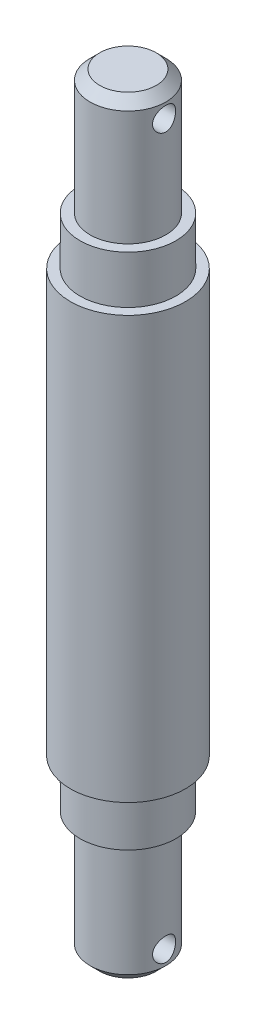
ISO-10303-21;
HEADER;
FILE_DESCRIPTION(('STEP AP214'),'2;1');
FILE_NAME('part.step','',(''),(''),'','','');
FILE_SCHEMA(('AUTOMOTIVE_DESIGN { 1 0 10303 214 1 1 1 1 }'));
ENDSEC;
DATA;
#1=APPLICATION_CONTEXT('core data for automotive mechanical design processes');
#2=APPLICATION_PROTOCOL_DEFINITION('international standard','automotive_design',2000,#1);
#3=PRODUCT_CONTEXT('',#1,'mechanical');
#4=PRODUCT('Part','Part','',(#3));
#5=PRODUCT_RELATED_PRODUCT_CATEGORY('part','',(#4));
#6=PRODUCT_DEFINITION_FORMATION('','',#4);
#7=PRODUCT_DEFINITION_CONTEXT('part definition',#1,'design');
#8=PRODUCT_DEFINITION('design','',#6,#7);
#9=PRODUCT_DEFINITION_SHAPE('','',#8);
#10=(LENGTH_UNIT() NAMED_UNIT(*) SI_UNIT(.MILLI.,.METRE.));
#11=(NAMED_UNIT(*) PLANE_ANGLE_UNIT() SI_UNIT($,.RADIAN.));
#12=(NAMED_UNIT(*) SI_UNIT($,.STERADIAN.) SOLID_ANGLE_UNIT());
#13=UNCERTAINTY_MEASURE_WITH_UNIT(LENGTH_MEASURE(1.E-05),#10,'distance_accuracy_value','');
#14=(GEOMETRIC_REPRESENTATION_CONTEXT(3) GLOBAL_UNCERTAINTY_ASSIGNED_CONTEXT((#13)) GLOBAL_UNIT_ASSIGNED_CONTEXT((#10,
#11,#12)) REPRESENTATION_CONTEXT('',''));
#15=CARTESIAN_POINT('',(0.,0.,0.));
#16=DIRECTION('',(0.,0.,1.));
#17=DIRECTION('',(1.,0.,0.));
#18=AXIS2_PLACEMENT_3D('',#15,#16,#17);
#19=CARTESIAN_POINT('',(0.,44.,0.));
#20=DIRECTION('',(0.,-1.,0.));
#21=DIRECTION('',(0.,0.,-1.));
#22=AXIS2_PLACEMENT_3D('',#19,#20,#21);
#23=CYLINDRICAL_SURFACE('',#22,6.);
#24=CARTESIAN_POINT('',(0.,44.,0.));
#25=DIRECTION('',(0.,1.,0.));
#26=DIRECTION('',(0.,0.,1.));
#27=AXIS2_PLACEMENT_3D('',#24,#25,#26);
#28=CIRCLE('',#27,6.);
#29=CARTESIAN_POINT('',(0.,44.,6.));
#30=VERTEX_POINT('',#29);
#31=EDGE_CURVE('E147',#30,#30,#28,.T.);
#32=ORIENTED_EDGE('',*,*,#31,.F.);
#33=EDGE_LOOP('',(#32));
#34=FACE_BOUND('',#33,.T.);
#35=CARTESIAN_POINT('',(0.,0.,0.));
#36=DIRECTION('',(0.,1.,0.));
#37=DIRECTION('',(0.,0.,1.));
#38=AXIS2_PLACEMENT_3D('',#35,#36,#37);
#39=CIRCLE('',#38,6.);
#40=CARTESIAN_POINT('',(0.,0.,6.));
#41=VERTEX_POINT('',#40);
#42=EDGE_CURVE('E146',#41,#41,#39,.T.);
#43=ORIENTED_EDGE('',*,*,#42,.T.);
#44=EDGE_LOOP('',(#43));
#45=FACE_BOUND('',#44,.T.);
#46=ADVANCED_FACE('F33',(#34,#45),#23,.T.);
#47=CARTESIAN_POINT('',(0.,44.,0.));
#48=DIRECTION('',(0.,1.,0.));
#49=DIRECTION('',(0.,0.,1.));
#50=AXIS2_PLACEMENT_3D('',#47,#48,#49);
#51=PLANE('',#50);
#52=CARTESIAN_POINT('',(0.,44.,0.));
#53=DIRECTION('',(0.,1.,0.));
#54=DIRECTION('',(0.,0.,1.));
#55=AXIS2_PLACEMENT_3D('',#52,#53,#54);
#56=CIRCLE('',#55,5.);
#57=CARTESIAN_POINT('',(0.,44.,5.));
#58=VERTEX_POINT('',#57);
#59=EDGE_CURVE('E138',#58,#58,#56,.F.);
#60=ORIENTED_EDGE('',*,*,#59,.T.);
#61=EDGE_LOOP('',(#60));
#62=FACE_BOUND('',#61,.T.);
#63=ORIENTED_EDGE('',*,*,#31,.T.);
#64=EDGE_LOOP('',(#63));
#65=FACE_BOUND('',#64,.T.);
#66=ADVANCED_FACE('F95',(#62,#65),#51,.T.);
#67=CARTESIAN_POINT('',(0.,0.,0.));
#68=DIRECTION('',(0.,1.,0.));
#69=DIRECTION('',(0.,0.,1.));
#70=AXIS2_PLACEMENT_3D('',#67,#68,#69);
#71=PLANE('',#70);
#72=CARTESIAN_POINT('',(0.,0.,0.));
#73=DIRECTION('',(0.,1.,0.));
#74=DIRECTION('',(0.,0.,1.));
#75=AXIS2_PLACEMENT_3D('',#72,#73,#74);
#76=CIRCLE('',#75,5.);
#77=CARTESIAN_POINT('',(0.,0.,5.));
#78=VERTEX_POINT('',#77);
#79=EDGE_CURVE('E150',#78,#78,#76,.F.);
#80=ORIENTED_EDGE('',*,*,#79,.F.);
#81=EDGE_LOOP('',(#80));
#82=FACE_BOUND('',#81,.T.);
#83=ORIENTED_EDGE('',*,*,#42,.F.);
#84=EDGE_LOOP('',(#83));
#85=FACE_BOUND('',#84,.T.);
#86=ADVANCED_FACE('F101',(#82,#85),#71,.F.);
#87=CARTESIAN_POINT('',(0.,-5.,0.));
#88=DIRECTION('',(0.,-1.,0.));
#89=DIRECTION('',(0.,0.,-1.));
#90=AXIS2_PLACEMENT_3D('',#87,#88,#89);
#91=PLANE('',#90);
#92=CARTESIAN_POINT('',(0.,-5.,0.));
#93=DIRECTION('',(0.,-1.,0.));
#94=DIRECTION('',(0.,0.,-1.));
#95=AXIS2_PLACEMENT_3D('',#92,#93,#94);
#96=CIRCLE('',#95,3.95);
#97=CARTESIAN_POINT('',(0.,-5.,-3.95));
#98=VERTEX_POINT('',#97);
#99=EDGE_CURVE('E142',#98,#98,#96,.T.);
#100=ORIENTED_EDGE('',*,*,#99,.F.);
#101=EDGE_LOOP('',(#100));
#102=FACE_BOUND('',#101,.T.);
#103=CARTESIAN_POINT('',(0.,-5.,0.));
#104=DIRECTION('',(0.,-1.,0.));
#105=DIRECTION('',(0.,0.,-1.));
#106=AXIS2_PLACEMENT_3D('',#103,#104,#105);
#107=CIRCLE('',#106,5.);
#108=CARTESIAN_POINT('',(0.,-5.,-5.));
#109=VERTEX_POINT('',#108);
#110=EDGE_CURVE('E135',#109,#109,#107,.T.);
#111=ORIENTED_EDGE('',*,*,#110,.T.);
#112=EDGE_LOOP('',(#111));
#113=FACE_BOUND('',#112,.T.);
#114=ADVANCED_FACE('F113',(#102,#113),#91,.T.);
#115=CARTESIAN_POINT('',(0.,-5.,0.));
#116=DIRECTION('',(0.,1.,0.));
#117=DIRECTION('',(0.,0.,1.));
#118=AXIS2_PLACEMENT_3D('',#115,#116,#117);
#119=CYLINDRICAL_SURFACE('',#118,5.);
#120=ORIENTED_EDGE('',*,*,#110,.F.);
#121=EDGE_LOOP('',(#120));
#122=FACE_BOUND('',#121,.T.);
#123=ORIENTED_EDGE('',*,*,#79,.T.);
#124=EDGE_LOOP('',(#123));
#125=FACE_BOUND('',#124,.T.);
#126=ADVANCED_FACE('F119',(#122,#125),#119,.T.);
#127=ORIENTED_EDGE('',*,*,#59,.F.);
#128=EDGE_LOOP('',(#127));
#129=FACE_BOUND('',#128,.T.);
#130=CARTESIAN_POINT('',(0.,49.,0.));
#131=DIRECTION('',(0.,-1.,0.));
#132=DIRECTION('',(0.,0.,-1.));
#133=AXIS2_PLACEMENT_3D('',#130,#131,#132);
#134=CIRCLE('',#133,5.);
#135=CARTESIAN_POINT('',(0.,49.,-5.));
#136=VERTEX_POINT('',#135);
#137=EDGE_CURVE('E133',#136,#136,#134,.T.);
#138=ORIENTED_EDGE('',*,*,#137,.T.);
#139=EDGE_LOOP('',(#138));
#140=FACE_BOUND('',#139,.T.);
#141=ADVANCED_FACE('F116',(#129,#140),#119,.T.);
#142=CARTESIAN_POINT('',(0.,49.,0.));
#143=DIRECTION('',(0.,-1.,0.));
#144=DIRECTION('',(0.,0.,-1.));
#145=AXIS2_PLACEMENT_3D('',#142,#143,#144);
#146=PLANE('',#145);
#147=CARTESIAN_POINT('',(0.,49.,0.));
#148=DIRECTION('',(0.,-1.,0.));
#149=DIRECTION('',(0.,0.,-1.));
#150=AXIS2_PLACEMENT_3D('',#147,#148,#149);
#151=CIRCLE('',#150,3.95);
#152=CARTESIAN_POINT('',(0.,49.,-3.95));
#153=VERTEX_POINT('',#152);
#154=EDGE_CURVE('E130',#153,#153,#151,.T.);
#155=ORIENTED_EDGE('',*,*,#154,.T.);
#156=EDGE_LOOP('',(#155));
#157=FACE_BOUND('',#156,.T.);
#158=ORIENTED_EDGE('',*,*,#137,.F.);
#159=EDGE_LOOP('',(#158));
#160=FACE_BOUND('',#159,.T.);
#161=ADVANCED_FACE('F82',(#157,#160),#146,.F.);
#162=CARTESIAN_POINT('',(0.,62.,0.));
#163=DIRECTION('',(0.,1.,0.));
#164=DIRECTION('',(0.,0.,1.));
#165=AXIS2_PLACEMENT_3D('',#162,#163,#164);
#166=PLANE('',#165);
#167=CARTESIAN_POINT('',(0.,62.,0.));
#168=DIRECTION('',(0.,1.,0.));
#169=DIRECTION('',(0.,0.,1.));
#170=AXIS2_PLACEMENT_3D('',#167,#168,#169);
#171=CIRCLE('',#170,2.95);
#172=CARTESIAN_POINT('',(0.,62.,2.95));
#173=VERTEX_POINT('',#172);
#174=EDGE_CURVE('E155',#173,#173,#171,.T.);
#175=ORIENTED_EDGE('',*,*,#174,.T.);
#176=EDGE_LOOP('',(#175));
#177=FACE_BOUND('',#176,.T.);
#178=ADVANCED_FACE('F78',(#177),#166,.T.);
#179=CARTESIAN_POINT('',(0.,-18.,0.));
#180=DIRECTION('',(0.,1.,0.));
#181=DIRECTION('',(0.,0.,1.));
#182=AXIS2_PLACEMENT_3D('',#179,#180,#181);
#183=CYLINDRICAL_SURFACE('',#182,3.95);
#184=CARTESIAN_POINT('',(-3.76330971353674,59.5,-1.2));
#185=CARTESIAN_POINT('',(-3.76331031666007,59.4342869926232,-1.19999928955701));
#186=CARTESIAN_POINT('',(-3.7650497181487,59.3685669566552,-1.19458390291693));
#187=CARTESIAN_POINT('',(-3.77179070728179,59.2390510835481,-1.17312308894901));
#188=CARTESIAN_POINT('',(-3.7767933216099,59.1752558586113,-1.1570743160823));
#189=CARTESIAN_POINT('',(-3.78944298426706,59.0514836230849,-1.11494420920335));
#190=CARTESIAN_POINT('',(-3.79708554829954,58.9915003406798,-1.08887987952481));
#191=CARTESIAN_POINT('',(-3.81414786762899,58.876742568391,-1.02751466965857));
#192=CARTESIAN_POINT('',(-3.82356790350834,58.821968902926,-0.992212330866388));
#193=CARTESIAN_POINT('',(-3.8434666706029,58.7174073950043,-0.912146360257625));
#194=CARTESIAN_POINT('',(-3.85396839206988,58.667813592303,-0.867134979222192));
#195=CARTESIAN_POINT('',(-3.8746510891713,58.5767494003631,-0.769459324041255));
#196=CARTESIAN_POINT('',(-3.88483202238293,58.5352800817988,-0.716794042827508));
#197=CARTESIAN_POINT('',(-3.9039877228981,58.4607953324269,-0.603920990967675));
#198=CARTESIAN_POINT('',(-3.91293225070488,58.4279783421893,-0.543576688024615));
#199=CARTESIAN_POINT('',(-3.92833981706148,58.3730337911179,-0.417907770183142));
#200=CARTESIAN_POINT('',(-3.93480340508098,58.3509038630712,-0.352584261907155));
#201=CARTESIAN_POINT('',(-3.94435813159895,58.3186054863261,-0.220841752036007));
#202=CARTESIAN_POINT('',(-3.94754249662551,58.3081056975429,-0.154510866613134));
#203=CARTESIAN_POINT('',(-3.95050858034244,58.2983173110792,-0.0209576127496339));
#204=CARTESIAN_POINT('',(-3.95029103132449,58.2990263006117,0.046264560720695));
#205=CARTESIAN_POINT('',(-3.94654340150569,58.3114142701222,0.177365433869229));
#206=CARTESIAN_POINT('',(-3.94312170657743,58.3227343247832,0.241281637680937));
#207=CARTESIAN_POINT('',(-3.93348245124689,58.3554359961875,0.366260082461795));
#208=CARTESIAN_POINT('',(-3.92726471210495,58.3768182561704,0.427322140701579));
#209=CARTESIAN_POINT('',(-3.91258346672345,58.4292766646195,0.545704635093445));
#210=CARTESIAN_POINT('',(-3.9040942622956,58.460464503431,0.602972259991862));
#211=CARTESIAN_POINT('',(-3.88576872978898,58.5315600400784,0.711575026037658));
#212=CARTESIAN_POINT('',(-3.87593207589258,58.5714698483086,0.762908726790566));
#213=CARTESIAN_POINT('',(-3.85550417866218,58.6607323384855,0.860327970576577));
#214=CARTESIAN_POINT('',(-3.84489847642231,58.7103956709708,0.906126226960098));
#215=CARTESIAN_POINT('',(-3.82446610848926,58.8167998155064,0.988826771142143));
#216=CARTESIAN_POINT('',(-3.81463952444775,58.8735413677555,1.02572812736943));
#217=CARTESIAN_POINT('',(-3.79680773590534,58.9932642043689,1.08989726798296));
#218=CARTESIAN_POINT('',(-3.78882183614087,59.0563024855972,1.11706447000663));
#219=CARTESIAN_POINT('',(-3.7758038479093,59.1863589312343,1.16031083347001));
#220=CARTESIAN_POINT('',(-3.77077076689899,59.2533757499704,1.17639372104432));
#221=CARTESIAN_POINT('',(-3.76444686513548,59.3867472124612,1.19647276195846));
#222=CARTESIAN_POINT('',(-3.76302061118328,59.45302959203,1.20090658845166));
#223=CARTESIAN_POINT('',(-3.763696891743,59.585393960393,1.19878581496245));
#224=CARTESIAN_POINT('',(-3.76579891714781,59.6514759767199,1.1922328003079));
#225=CARTESIAN_POINT('',(-3.77316174966259,59.7797207289767,1.16871455631674));
#226=CARTESIAN_POINT('',(-3.77833623913779,59.8419410563201,1.15203358279966));
#227=CARTESIAN_POINT('',(-3.79117092753935,59.9626947263443,1.10906377418996));
#228=CARTESIAN_POINT('',(-3.79883151684524,60.0212274882608,1.08277343010514));
#229=CARTESIAN_POINT('',(-3.81603606009353,60.1347183378462,1.02050789468549));
#230=CARTESIAN_POINT('',(-3.82562586475256,60.1895345456271,0.984287088725512));
#231=CARTESIAN_POINT('',(-3.84551089618456,60.2924705849936,0.903478996830666));
#232=CARTESIAN_POINT('',(-3.85580629574318,60.3405887675637,0.85888965693332));
#233=CARTESIAN_POINT('',(-3.87642643567929,60.4306893207721,0.760548602057037));
#234=CARTESIAN_POINT('',(-3.88673678265196,60.4723607633638,0.706508271262426));
#235=CARTESIAN_POINT('',(-3.90582333686135,60.5460527758563,0.591954968425848));
#236=CARTESIAN_POINT('',(-3.91459961873456,60.5780738153305,0.531442311511362));
#237=CARTESIAN_POINT('',(-3.92957652619322,60.6312472089805,0.406054835594853));
#238=CARTESIAN_POINT('',(-3.93579618062284,60.6524801488839,0.341216579421755));
#239=CARTESIAN_POINT('',(-3.94504299892431,60.6836761325366,0.208668709180416));
#240=CARTESIAN_POINT('',(-3.94807110170266,60.6936424908076,0.140959945673024));
#241=CARTESIAN_POINT('',(-3.95053495256332,60.7017651434184,0.00746305887763391));
#242=CARTESIAN_POINT('',(-3.95010769540593,60.7003717979896,-0.0582954695601481));
#243=CARTESIAN_POINT('',(-3.94603329453889,60.686894951455,-0.188600190708616));
#244=CARTESIAN_POINT('',(-3.94238634145233,60.6748120832256,-0.25314645496073));
#245=CARTESIAN_POINT('',(-3.93232268099035,60.6405803852541,-0.378484939604573));
#246=CARTESIAN_POINT('',(-3.92593761167292,60.6185463875531,-0.439311237373909));
#247=CARTESIAN_POINT('',(-3.9110573534815,60.5651408800018,-0.556434673058298));
#248=CARTESIAN_POINT('',(-3.90256181302903,60.5337678142052,-0.612731054274324));
#249=CARTESIAN_POINT('',(-3.88400704310811,60.4613902354797,-0.721191257214665));
#250=CARTESIAN_POINT('',(-3.87390587878802,60.4201051747395,-0.773160625998069));
#251=CARTESIAN_POINT('',(-3.85340865354173,60.3295776192704,-0.869584065464126));
#252=CARTESIAN_POINT('',(-3.84301250743062,60.2803328062374,-0.914035938909721));
#253=CARTESIAN_POINT('',(-3.82272452906287,60.1734644821111,-0.995539285224903));
#254=CARTESIAN_POINT('',(-3.81285808302304,60.1156296640474,-1.03232073531764));
#255=CARTESIAN_POINT('',(-3.79516160158072,59.9943088567936,-1.09559760989955));
#256=CARTESIAN_POINT('',(-3.78733063382032,59.9308254728994,-1.1220977465301));
#257=CARTESIAN_POINT('',(-3.77532652218149,59.806620359224,-1.1618071335272));
#258=CARTESIAN_POINT('',(-3.7708636153341,59.7462682980644,-1.17608922498181));
#259=CARTESIAN_POINT('',(-3.7648552380294,59.6239460096901,-1.19518498249927));
#260=CARTESIAN_POINT('',(-3.763309144711,59.561976130813,-1.2000006700425));
#261=CARTESIAN_POINT('',(-3.76330971353674,59.5,-1.2));
#262=B_SPLINE_CURVE_WITH_KNOTS('',3,(#184,#185,#186,#187,#188,#189,#190,#191,#192,#193,#194,
#195,#196,#197,#198,#199,#200,#201,#202,#203,#204,#205,#206,#207,#208,#209,#210,#211,#212,#213,
#214,#215,#216,#217,#218,#219,#220,#221,#222,#223,#224,#225,#226,#227,#228,#229,#230,#231,#232,
#233,#234,#235,#236,#237,#238,#239,#240,#241,#242,#243,#244,#245,#246,#247,#248,#249,#250,#251,
#252,#253,#254,#255,#256,#257,#258,#259,#260,#261),.UNSPECIFIED.,.T.,.F.,(4,2,2,2,2,2,2,2,2,2,2,
2,2,2,2,2,2,2,2,2,2,2,2,2,2,2,2,2,2,2,2,2,2,2,2,2,2,2,4),(0.,0.196910306936295,
0.393882596395955,0.590521934955348,0.787192339976843,0.989647548186722,1.19212941876558,
1.39891540583195,1.6056555682152,1.80634082085335,2.00698287483511,2.20107397795393,
2.39517749028621,2.59157733311675,2.78802475016897,2.9922295387445,3.19645569979462,
3.40273507852054,3.60894507991807,3.80728870830381,4.00560371949066,4.19859464252232,
4.39161588460553,4.5899256172109,4.78828408651159,4.99434729373731,5.20040047262948,
5.40489095663165,5.60932126580221,5.80568746914948,6.00204204735454,6.19618648295658,
6.39036328234151,6.59086780546126,6.79143083176249,6.99816964858289,7.20481360042108,
7.39056595427499,7.57627863777966),.UNSPECIFIED.);
#263=CARTESIAN_POINT('',(-3.76330971353674,59.5,-1.2));
#264=VERTEX_POINT('',#263);
#265=EDGE_CURVE('E63',#264,#264,#262,.T.);
#266=ORIENTED_EDGE('',*,*,#265,.F.);
#267=EDGE_LOOP('',(#266));
#268=FACE_BOUND('',#267,.T.);
#269=CARTESIAN_POINT('',(3.76330971353674,59.5,-1.2));
#270=CARTESIAN_POINT('',(3.76331031666007,59.5657130073768,-1.19999928955701));
#271=CARTESIAN_POINT('',(3.7650497181487,59.6314330433448,-1.19458390291693));
#272=CARTESIAN_POINT('',(3.77179070728179,59.7609489164519,-1.17312308894901));
#273=CARTESIAN_POINT('',(3.7767933216099,59.8247441413887,-1.1570743160823));
#274=CARTESIAN_POINT('',(3.78944298426706,59.9485163769151,-1.11494420920335));
#275=CARTESIAN_POINT('',(3.79708554829954,60.0084996593202,-1.08887987952481));
#276=CARTESIAN_POINT('',(3.81414786762899,60.123257431609,-1.02751466965857));
#277=CARTESIAN_POINT('',(3.82356790350834,60.178031097074,-0.992212330866387));
#278=CARTESIAN_POINT('',(3.8434666706029,60.2825926049957,-0.912146360257626));
#279=CARTESIAN_POINT('',(3.85396839206988,60.332186407697,-0.867134979222194));
#280=CARTESIAN_POINT('',(3.8746510891713,60.4232505996369,-0.769459324041258));
#281=CARTESIAN_POINT('',(3.88483202238293,60.4647199182011,-0.716794042827509));
#282=CARTESIAN_POINT('',(3.9039877228981,60.539204667573,-0.603920990967674));
#283=CARTESIAN_POINT('',(3.91293225070488,60.5720216578107,-0.543576688024615));
#284=CARTESIAN_POINT('',(3.92833981706148,60.6269662088821,-0.417907770183142));
#285=CARTESIAN_POINT('',(3.93480340508098,60.6490961369288,-0.352584261907156));
#286=CARTESIAN_POINT('',(3.94435813159895,60.6813945136739,-0.220841752036008));
#287=CARTESIAN_POINT('',(3.94754249662551,60.6918943024571,-0.154510866613135));
#288=CARTESIAN_POINT('',(3.95050858034244,60.7016826889208,-0.0209576127496344));
#289=CARTESIAN_POINT('',(3.95029103132449,60.7009736993883,0.0462645607206945));
#290=CARTESIAN_POINT('',(3.94654340150569,60.6885857298778,0.177365433869229));
#291=CARTESIAN_POINT('',(3.94312170657743,60.6772656752168,0.241281637680936));
#292=CARTESIAN_POINT('',(3.93348245124689,60.6445640038125,0.366260082461794));
#293=CARTESIAN_POINT('',(3.92726471210495,60.6231817438296,0.427322140701579));
#294=CARTESIAN_POINT('',(3.91258346672345,60.5707233353805,0.545704635093445));
#295=CARTESIAN_POINT('',(3.9040942622956,60.539535496569,0.602972259991862));
#296=CARTESIAN_POINT('',(3.88576872978898,60.4684399599216,0.711575026037658));
#297=CARTESIAN_POINT('',(3.87593207589258,60.4285301516914,0.762908726790565));
#298=CARTESIAN_POINT('',(3.85550417866218,60.3392676615145,0.86032797057658));
#299=CARTESIAN_POINT('',(3.84489847642231,60.2896043290292,0.906126226960104));
#300=CARTESIAN_POINT('',(3.82446610848926,60.1832001844936,0.988826771142149));
#301=CARTESIAN_POINT('',(3.81463952444775,60.1264586322445,1.02572812736943));
#302=CARTESIAN_POINT('',(3.79680773590534,60.006735795631,1.08989726798296));
#303=CARTESIAN_POINT('',(3.78882183614086,59.9436975144028,1.11706447000663));
#304=CARTESIAN_POINT('',(3.77580384790929,59.8136410687657,1.16031083347002));
#305=CARTESIAN_POINT('',(3.77077076689899,59.7466242500296,1.17639372104432));
#306=CARTESIAN_POINT('',(3.76444686513548,59.6132527875388,1.19647276195846));
#307=CARTESIAN_POINT('',(3.76302061118328,59.54697040797,1.20090658845166));
#308=CARTESIAN_POINT('',(3.763696891743,59.414606039607,1.19878581496245));
#309=CARTESIAN_POINT('',(3.76579891714781,59.3485240232801,1.1922328003079));
#310=CARTESIAN_POINT('',(3.77316174966259,59.2202792710233,1.16871455631674));
#311=CARTESIAN_POINT('',(3.77833623913779,59.1580589436799,1.15203358279966));
#312=CARTESIAN_POINT('',(3.79117092753935,59.0373052736557,1.10906377418996));
#313=CARTESIAN_POINT('',(3.79883151684524,58.9787725117392,1.08277343010514));
#314=CARTESIAN_POINT('',(3.81603606009353,58.8652816621538,1.02050789468549));
#315=CARTESIAN_POINT('',(3.82562586475256,58.8104654543729,0.984287088725513));
#316=CARTESIAN_POINT('',(3.84551089618456,58.7075294150064,0.90347899683067));
#317=CARTESIAN_POINT('',(3.85580629574318,58.6594112324363,0.858889656933325));
#318=CARTESIAN_POINT('',(3.87642643567929,58.5693106792279,0.760548602057044));
#319=CARTESIAN_POINT('',(3.88673678265196,58.5276392366362,0.706508271262434));
#320=CARTESIAN_POINT('',(3.90582333686135,58.4539472241437,0.591954968425855));
#321=CARTESIAN_POINT('',(3.91459961873456,58.4219261846695,0.531442311511367));
#322=CARTESIAN_POINT('',(3.92957652619322,58.3687527910195,0.406054835594857));
#323=CARTESIAN_POINT('',(3.93579618062284,58.3475198511161,0.341216579421759));
#324=CARTESIAN_POINT('',(3.94504299892431,58.3163238674633,0.208668709180418));
#325=CARTESIAN_POINT('',(3.94807110170266,58.3063575091924,0.140959945673025));
#326=CARTESIAN_POINT('',(3.95053495256332,58.2982348565816,0.00746305887763399));
#327=CARTESIAN_POINT('',(3.95010769540593,58.2996282020104,-0.0582954695601479));
#328=CARTESIAN_POINT('',(3.94603329453889,58.313105048545,-0.188600190708616));
#329=CARTESIAN_POINT('',(3.94238634145233,58.3251879167744,-0.25314645496073));
#330=CARTESIAN_POINT('',(3.93232268099035,58.3594196147459,-0.378484939604574));
#331=CARTESIAN_POINT('',(3.92593761167292,58.3814536124469,-0.439311237373911));
#332=CARTESIAN_POINT('',(3.9110573534815,58.4348591199982,-0.5564346730583));
#333=CARTESIAN_POINT('',(3.90256181302903,58.4662321857948,-0.612731054274325));
#334=CARTESIAN_POINT('',(3.88400704310811,58.5386097645203,-0.721191257214665));
#335=CARTESIAN_POINT('',(3.87390587878802,58.5798948252605,-0.773160625998069));
#336=CARTESIAN_POINT('',(3.85340865354173,58.6704223807296,-0.869584065464125));
#337=CARTESIAN_POINT('',(3.84301250743062,58.7196671937626,-0.914035938909721));
#338=CARTESIAN_POINT('',(3.82272452906287,58.8265355178889,-0.995539285224905));
#339=CARTESIAN_POINT('',(3.81285808302304,58.8843703359526,-1.03232073531765));
#340=CARTESIAN_POINT('',(3.79516160158072,59.0056911432064,-1.09559760989955));
#341=CARTESIAN_POINT('',(3.78733063382032,59.0691745271006,-1.12209774653011));
#342=CARTESIAN_POINT('',(3.77532652218149,59.193379640776,-1.1618071335272));
#343=CARTESIAN_POINT('',(3.7708636153341,59.2537317019356,-1.17608922498181));
#344=CARTESIAN_POINT('',(3.7648552380294,59.3760539903099,-1.19518498249927));
#345=CARTESIAN_POINT('',(3.763309144711,59.438023869187,-1.2000006700425));
#346=CARTESIAN_POINT('',(3.76330971353674,59.5,-1.2));
#347=B_SPLINE_CURVE_WITH_KNOTS('',3,(#269,#270,#271,#272,#273,#274,#275,#276,#277,#278,#279,
#280,#281,#282,#283,#284,#285,#286,#287,#288,#289,#290,#291,#292,#293,#294,#295,#296,#297,#298,
#299,#300,#301,#302,#303,#304,#305,#306,#307,#308,#309,#310,#311,#312,#313,#314,#315,#316,#317,
#318,#319,#320,#321,#322,#323,#324,#325,#326,#327,#328,#329,#330,#331,#332,#333,#334,#335,#336,
#337,#338,#339,#340,#341,#342,#343,#344,#345,#346),.UNSPECIFIED.,.T.,.F.,(4,2,2,2,2,2,2,2,2,2,2,
2,2,2,2,2,2,2,2,2,2,2,2,2,2,2,2,2,2,2,2,2,2,2,2,2,2,2,4),(0.,0.196910306936295,
0.393882596395955,0.590521934955348,0.787192339976843,0.98964754818672,1.19212941876558,
1.39891540583195,1.6056555682152,1.80634082085335,2.0069828748351,2.20107397795393,
2.39517749028621,2.59157733311675,2.78802475016897,2.99222953874451,3.19645569979463,
3.40273507852054,3.60894507991808,3.80728870830381,4.00560371949065,4.19859464252231,
4.39161588460553,4.5899256172109,4.78828408651158,4.9943472937373,5.20040047262947,
5.40489095663165,5.60932126580221,5.80568746914948,6.00204204735454,6.19618648295658,
6.39036328234151,6.59086780546126,6.79143083176249,6.9981696485829,7.20481360042108,
7.390565954275,7.57627863777966),.UNSPECIFIED.);
#348=CARTESIAN_POINT('',(3.76330971353674,59.5,-1.2));
#349=VERTEX_POINT('',#348);
#350=EDGE_CURVE('E56',#349,#349,#347,.T.);
#351=ORIENTED_EDGE('',*,*,#350,.F.);
#352=EDGE_LOOP('',(#351));
#353=FACE_BOUND('',#352,.T.);
#354=CARTESIAN_POINT('',(0.,61.,0.));
#355=DIRECTION('',(0.,1.,0.));
#356=DIRECTION('',(0.,0.,1.));
#357=AXIS2_PLACEMENT_3D('',#354,#355,#356);
#358=CIRCLE('',#357,3.95);
#359=CARTESIAN_POINT('',(0.,61.,3.95));
#360=VERTEX_POINT('',#359);
#361=EDGE_CURVE('E52',#360,#360,#358,.F.);
#362=ORIENTED_EDGE('',*,*,#361,.T.);
#363=EDGE_LOOP('',(#362));
#364=FACE_BOUND('',#363,.T.);
#365=ORIENTED_EDGE('',*,*,#154,.F.);
#366=EDGE_LOOP('',(#365));
#367=FACE_BOUND('',#366,.T.);
#368=ADVANCED_FACE('F81',(#268,#353,#364,#367),#183,.T.);
#369=CARTESIAN_POINT('',(-3.76330971353674,-15.5,-1.2));
#370=CARTESIAN_POINT('',(-3.76331031666007,-15.5657130073768,-1.19999928955701));
#371=CARTESIAN_POINT('',(-3.7650497181487,-15.6314330433448,-1.19458390291693));
#372=CARTESIAN_POINT('',(-3.77179070728179,-15.7609489164519,-1.17312308894901));
#373=CARTESIAN_POINT('',(-3.7767933216099,-15.8247441413887,-1.1570743160823));
#374=CARTESIAN_POINT('',(-3.78944298426706,-15.9485163769151,-1.11494420920335));
#375=CARTESIAN_POINT('',(-3.79708554829954,-16.0084996593202,-1.08887987952481));
#376=CARTESIAN_POINT('',(-3.81414786762899,-16.123257431609,-1.02751466965857));
#377=CARTESIAN_POINT('',(-3.82356790350834,-16.178031097074,-0.992212330866386));
#378=CARTESIAN_POINT('',(-3.8434666706029,-16.2825926049957,-0.912146360257624));
#379=CARTESIAN_POINT('',(-3.85396839206988,-16.332186407697,-0.867134979222192));
#380=CARTESIAN_POINT('',(-3.8746510891713,-16.4232505996369,-0.769459324041256));
#381=CARTESIAN_POINT('',(-3.88483202238293,-16.4647199182012,-0.716794042827507));
#382=CARTESIAN_POINT('',(-3.9039877228981,-16.5392046675731,-0.603920990967672));
#383=CARTESIAN_POINT('',(-3.91293225070488,-16.5720216578107,-0.543576688024611));
#384=CARTESIAN_POINT('',(-3.92833981706148,-16.6269662088821,-0.417907770183138));
#385=CARTESIAN_POINT('',(-3.93480340508098,-16.6490961369288,-0.352584261907152));
#386=CARTESIAN_POINT('',(-3.94435813159895,-16.6813945136739,-0.220841752036005));
#387=CARTESIAN_POINT('',(-3.94754249662551,-16.6918943024571,-0.154510866613131));
#388=CARTESIAN_POINT('',(-3.95050858034244,-16.7016826889208,-0.0209576127496303));
#389=CARTESIAN_POINT('',(-3.95029103132449,-16.7009736993883,0.0462645607206986));
#390=CARTESIAN_POINT('',(-3.94654340150569,-16.6885857298778,0.177365433869233));
#391=CARTESIAN_POINT('',(-3.94312170657743,-16.6772656752168,0.24128163768094));
#392=CARTESIAN_POINT('',(-3.93348245124689,-16.6445640038125,0.366260082461798));
#393=CARTESIAN_POINT('',(-3.92726471210495,-16.6231817438296,0.427322140701583));
#394=CARTESIAN_POINT('',(-3.91258346672345,-16.5707233353805,0.545704635093448));
#395=CARTESIAN_POINT('',(-3.9040942622956,-16.5395354965689,0.602972259991865));
#396=CARTESIAN_POINT('',(-3.88576872978898,-16.4684399599216,0.711575026037661));
#397=CARTESIAN_POINT('',(-3.87593207589258,-16.4285301516914,0.762908726790569));
#398=CARTESIAN_POINT('',(-3.85550417866218,-16.3392676615145,0.860327970576583));
#399=CARTESIAN_POINT('',(-3.84489847642231,-16.2896043290292,0.906126226960104));
#400=CARTESIAN_POINT('',(-3.82446610848926,-16.1832001844936,0.988826771142147));
#401=CARTESIAN_POINT('',(-3.81463952444775,-16.1264586322445,1.02572812736943));
#402=CARTESIAN_POINT('',(-3.79680773590534,-16.006735795631,1.08989726798296));
#403=CARTESIAN_POINT('',(-3.78882183614087,-15.9436975144028,1.11706447000663));
#404=CARTESIAN_POINT('',(-3.7758038479093,-15.8136410687657,1.16031083347002));
#405=CARTESIAN_POINT('',(-3.77077076689899,-15.7466242500296,1.17639372104432));
#406=CARTESIAN_POINT('',(-3.76444686513548,-15.6132527875388,1.19647276195846));
#407=CARTESIAN_POINT('',(-3.76302061118328,-15.54697040797,1.20090658845166));
#408=CARTESIAN_POINT('',(-3.763696891743,-15.414606039607,1.19878581496245));
#409=CARTESIAN_POINT('',(-3.76579891714781,-15.3485240232801,1.1922328003079));
#410=CARTESIAN_POINT('',(-3.77316174966259,-15.2202792710232,1.16871455631674));
#411=CARTESIAN_POINT('',(-3.77833623913779,-15.1580589436799,1.15203358279966));
#412=CARTESIAN_POINT('',(-3.79117092753935,-15.0373052736557,1.10906377418996));
#413=CARTESIAN_POINT('',(-3.79883151684524,-14.9787725117392,1.08277343010514));
#414=CARTESIAN_POINT('',(-3.81603606009353,-14.8652816621538,1.02050789468548));
#415=CARTESIAN_POINT('',(-3.82562586475256,-14.8104654543729,0.984287088725508));
#416=CARTESIAN_POINT('',(-3.84551089618456,-14.7075294150064,0.903478996830664));
#417=CARTESIAN_POINT('',(-3.85580629574318,-14.6594112324363,0.85888965693332));
#418=CARTESIAN_POINT('',(-3.87642643567929,-14.5693106792278,0.760548602057039));
#419=CARTESIAN_POINT('',(-3.88673678265196,-14.5276392366361,0.706508271262427));
#420=CARTESIAN_POINT('',(-3.90582333686135,-14.4539472241437,0.591954968425848));
#421=CARTESIAN_POINT('',(-3.91459961873456,-14.4219261846695,0.531442311511361));
#422=CARTESIAN_POINT('',(-3.92957652619322,-14.3687527910195,0.406054835594852));
#423=CARTESIAN_POINT('',(-3.93579618062284,-14.3475198511161,0.341216579421754));
#424=CARTESIAN_POINT('',(-3.94504299892431,-14.3163238674634,0.208668709180414));
#425=CARTESIAN_POINT('',(-3.94807110170266,-14.3063575091923,0.140959945673021));
#426=CARTESIAN_POINT('',(-3.95053495256332,-14.2982348565816,0.00746305887762972));
#427=CARTESIAN_POINT('',(-3.95010769540593,-14.2996282020104,-0.0582954695601521));
#428=CARTESIAN_POINT('',(-3.94603329453889,-14.313105048545,-0.18860019070862));
#429=CARTESIAN_POINT('',(-3.94238634145233,-14.3251879167744,-0.253146454960734));
#430=CARTESIAN_POINT('',(-3.93232268099035,-14.3594196147459,-0.378484939604577));
#431=CARTESIAN_POINT('',(-3.92593761167292,-14.3814536124469,-0.439311237373912));
#432=CARTESIAN_POINT('',(-3.9110573534815,-14.4348591199982,-0.556434673058302));
#433=CARTESIAN_POINT('',(-3.90256181302903,-14.4662321857948,-0.612731054274328));
#434=CARTESIAN_POINT('',(-3.88400704310811,-14.5386097645203,-0.721191257214669));
#435=CARTESIAN_POINT('',(-3.87390587878802,-14.5798948252605,-0.773160625998072));
#436=CARTESIAN_POINT('',(-3.85340865354173,-14.6704223807296,-0.869584065464129));
#437=CARTESIAN_POINT('',(-3.84301250743062,-14.7196671937626,-0.914035938909726));
#438=CARTESIAN_POINT('',(-3.82272452906287,-14.8265355178889,-0.99553928522491));
#439=CARTESIAN_POINT('',(-3.81285808302304,-14.8843703359526,-1.03232073531765));
#440=CARTESIAN_POINT('',(-3.79516160158072,-15.0056911432064,-1.09559760989956));
#441=CARTESIAN_POINT('',(-3.78733063382032,-15.0691745271006,-1.12209774653011));
#442=CARTESIAN_POINT('',(-3.77532652218149,-15.193379640776,-1.1618071335272));
#443=CARTESIAN_POINT('',(-3.7708636153341,-15.2537317019356,-1.17608922498181));
#444=CARTESIAN_POINT('',(-3.7648552380294,-15.3760539903099,-1.19518498249927));
#445=CARTESIAN_POINT('',(-3.763309144711,-15.438023869187,-1.2000006700425));
#446=CARTESIAN_POINT('',(-3.76330971353674,-15.5,-1.2));
#447=B_SPLINE_CURVE_WITH_KNOTS('',3,(#369,#370,#371,#372,#373,#374,#375,#376,#377,#378,#379,
#380,#381,#382,#383,#384,#385,#386,#387,#388,#389,#390,#391,#392,#393,#394,#395,#396,#397,#398,
#399,#400,#401,#402,#403,#404,#405,#406,#407,#408,#409,#410,#411,#412,#413,#414,#415,#416,#417,
#418,#419,#420,#421,#422,#423,#424,#425,#426,#427,#428,#429,#430,#431,#432,#433,#434,#435,#436,
#437,#438,#439,#440,#441,#442,#443,#444,#445,#446),.UNSPECIFIED.,.T.,.F.,(4,2,2,2,2,2,2,2,2,2,2,
2,2,2,2,2,2,2,2,2,2,2,2,2,2,2,2,2,2,2,2,2,2,2,2,2,2,2,4),(0.,0.196910306936297,
0.393882596395957,0.590521934955343,0.787192339976842,0.989647548186722,1.19212941876558,
1.39891540583195,1.60565556821521,1.80634082085335,2.00698287483511,2.20107397795393,
2.39517749028621,2.59157733311675,2.78802475016897,2.99222953874451,3.19645569979462,
3.40273507852054,3.60894507991808,3.80728870830381,4.00560371949067,4.19859464252233,
4.39161588460554,4.5899256172109,4.78828408651159,4.99434729373731,5.20040047262948,
5.40489095663166,5.60932126580222,5.80568746914949,6.00204204735454,6.19618648295659,
6.39036328234152,6.59086780546127,6.7914308317625,6.99816964858291,7.20481360042109,
7.39056595427499,7.57627863777966),.UNSPECIFIED.);
#448=CARTESIAN_POINT('',(-3.76330971353674,-15.5,-1.2));
#449=VERTEX_POINT('',#448);
#450=EDGE_CURVE('E38',#449,#449,#447,.T.);
#451=ORIENTED_EDGE('',*,*,#450,.F.);
#452=EDGE_LOOP('',(#451));
#453=FACE_BOUND('',#452,.T.);
#454=CARTESIAN_POINT('',(3.76330971353674,-15.5,-1.2));
#455=CARTESIAN_POINT('',(3.76331031666007,-15.4342869926232,-1.19999928955701));
#456=CARTESIAN_POINT('',(3.7650497181487,-15.3685669566552,-1.19458390291693));
#457=CARTESIAN_POINT('',(3.77179070728179,-15.2390510835481,-1.17312308894901));
#458=CARTESIAN_POINT('',(3.7767933216099,-15.1752558586113,-1.1570743160823));
#459=CARTESIAN_POINT('',(3.78944298426706,-15.0514836230849,-1.11494420920335));
#460=CARTESIAN_POINT('',(3.79708554829954,-14.9915003406798,-1.08887987952481));
#461=CARTESIAN_POINT('',(3.81414786762899,-14.876742568391,-1.02751466965857));
#462=CARTESIAN_POINT('',(3.82356790350834,-14.821968902926,-0.992212330866386));
#463=CARTESIAN_POINT('',(3.8434666706029,-14.7174073950043,-0.912146360257623));
#464=CARTESIAN_POINT('',(3.85396839206988,-14.667813592303,-0.867134979222189));
#465=CARTESIAN_POINT('',(3.8746510891713,-14.5767494003631,-0.769459324041252));
#466=CARTESIAN_POINT('',(3.88483202238293,-14.5352800817988,-0.716794042827504));
#467=CARTESIAN_POINT('',(3.9039877228981,-14.4607953324269,-0.60392099096767));
#468=CARTESIAN_POINT('',(3.91293225070488,-14.4279783421893,-0.54357668802461));
#469=CARTESIAN_POINT('',(3.92833981706148,-14.3730337911179,-0.417907770183138));
#470=CARTESIAN_POINT('',(3.93480340508098,-14.3509038630712,-0.352584261907152));
#471=CARTESIAN_POINT('',(3.94435813159895,-14.3186054863261,-0.220841752036005));
#472=CARTESIAN_POINT('',(3.94754249662551,-14.3081056975429,-0.154510866613131));
#473=CARTESIAN_POINT('',(3.95050858034244,-14.2983173110792,-0.02095761274963));
#474=CARTESIAN_POINT('',(3.95029103132449,-14.2990263006117,0.0462645607206989));
#475=CARTESIAN_POINT('',(3.94654340150569,-14.3114142701222,0.177365433869233));
#476=CARTESIAN_POINT('',(3.94312170657743,-14.3227343247832,0.24128163768094));
#477=CARTESIAN_POINT('',(3.93348245124689,-14.3554359961875,0.366260082461798));
#478=CARTESIAN_POINT('',(3.92726471210495,-14.3768182561704,0.427322140701583));
#479=CARTESIAN_POINT('',(3.91258346672345,-14.4292766646195,0.545704635093449));
#480=CARTESIAN_POINT('',(3.9040942622956,-14.4604645034311,0.602972259991866));
#481=CARTESIAN_POINT('',(3.88576872978898,-14.5315600400784,0.711575026037662));
#482=CARTESIAN_POINT('',(3.87593207589258,-14.5714698483086,0.76290872679057));
#483=CARTESIAN_POINT('',(3.85550417866218,-14.6607323384855,0.860327970576583));
#484=CARTESIAN_POINT('',(3.84489847642231,-14.7103956709708,0.906126226960104));
#485=CARTESIAN_POINT('',(3.82446610848926,-14.8167998155064,0.988826771142148));
#486=CARTESIAN_POINT('',(3.81463952444775,-14.8735413677555,1.02572812736943));
#487=CARTESIAN_POINT('',(3.79680773590534,-14.993264204369,1.08989726798297));
#488=CARTESIAN_POINT('',(3.78882183614086,-15.0563024855972,1.11706447000663));
#489=CARTESIAN_POINT('',(3.77580384790929,-15.1863589312343,1.16031083347002));
#490=CARTESIAN_POINT('',(3.77077076689899,-15.2533757499704,1.17639372104432));
#491=CARTESIAN_POINT('',(3.76444686513548,-15.3867472124612,1.19647276195846));
#492=CARTESIAN_POINT('',(3.76302061118328,-15.45302959203,1.20090658845166));
#493=CARTESIAN_POINT('',(3.763696891743,-15.585393960393,1.19878581496245));
#494=CARTESIAN_POINT('',(3.76579891714781,-15.6514759767199,1.1922328003079));
#495=CARTESIAN_POINT('',(3.77316174966259,-15.7797207289768,1.16871455631674));
#496=CARTESIAN_POINT('',(3.77833623913779,-15.8419410563201,1.15203358279966));
#497=CARTESIAN_POINT('',(3.79117092753935,-15.9626947263443,1.10906377418996));
#498=CARTESIAN_POINT('',(3.79883151684525,-16.0212274882609,1.08277343010514));
#499=CARTESIAN_POINT('',(3.81603606009353,-16.1347183378462,1.02050789468548));
#500=CARTESIAN_POINT('',(3.82562586475256,-16.1895345456272,0.984287088725508));
#501=CARTESIAN_POINT('',(3.84551089618456,-16.2924705849936,0.903478996830664));
#502=CARTESIAN_POINT('',(3.85580629574318,-16.3405887675637,0.85888965693332));
#503=CARTESIAN_POINT('',(3.87642643567929,-16.4306893207722,0.760548602057039));
#504=CARTESIAN_POINT('',(3.88673678265196,-16.4723607633639,0.706508271262427));
#505=CARTESIAN_POINT('',(3.90582333686135,-16.5460527758563,0.591954968425847));
#506=CARTESIAN_POINT('',(3.91459961873456,-16.5780738153305,0.53144231151136));
#507=CARTESIAN_POINT('',(3.92957652619322,-16.6312472089805,0.406054835594851));
#508=CARTESIAN_POINT('',(3.93579618062284,-16.6524801488839,0.341216579421753));
#509=CARTESIAN_POINT('',(3.94504299892431,-16.6836761325367,0.208668709180414));
#510=CARTESIAN_POINT('',(3.94807110170266,-16.6936424908077,0.140959945673021));
#511=CARTESIAN_POINT('',(3.95053495256332,-16.7017651434184,0.00746305887763059));
#512=CARTESIAN_POINT('',(3.95010769540593,-16.7003717979896,-0.0582954695601513));
#513=CARTESIAN_POINT('',(3.94603329453889,-16.686894951455,-0.188600190708619));
#514=CARTESIAN_POINT('',(3.94238634145233,-16.6748120832256,-0.253146454960734));
#515=CARTESIAN_POINT('',(3.93232268099035,-16.6405803852541,-0.378484939604577));
#516=CARTESIAN_POINT('',(3.92593761167292,-16.6185463875531,-0.439311237373913));
#517=CARTESIAN_POINT('',(3.9110573534815,-16.5651408800018,-0.556434673058303));
#518=CARTESIAN_POINT('',(3.90256181302903,-16.5337678142052,-0.612731054274329));
#519=CARTESIAN_POINT('',(3.88400704310811,-16.4613902354797,-0.72119125721467));
#520=CARTESIAN_POINT('',(3.87390587878802,-16.4201051747395,-0.773160625998073));
#521=CARTESIAN_POINT('',(3.85340865354173,-16.3295776192704,-0.86958406546413));
#522=CARTESIAN_POINT('',(3.84301250743061,-16.2803328062374,-0.914035938909725));
#523=CARTESIAN_POINT('',(3.82272452906287,-16.1734644821111,-0.995539285224908));
#524=CARTESIAN_POINT('',(3.81285808302304,-16.1156296640474,-1.03232073531765));
#525=CARTESIAN_POINT('',(3.79516160158072,-15.9943088567936,-1.09559760989956));
#526=CARTESIAN_POINT('',(3.78733063382032,-15.9308254728994,-1.12209774653011));
#527=CARTESIAN_POINT('',(3.77532652218149,-15.806620359224,-1.1618071335272));
#528=CARTESIAN_POINT('',(3.77086361533411,-15.7462682980644,-1.17608922498181));
#529=CARTESIAN_POINT('',(3.7648552380294,-15.6239460096901,-1.19518498249927));
#530=CARTESIAN_POINT('',(3.763309144711,-15.561976130813,-1.2000006700425));
#531=CARTESIAN_POINT('',(3.76330971353674,-15.5,-1.2));
#532=B_SPLINE_CURVE_WITH_KNOTS('',3,(#454,#455,#456,#457,#458,#459,#460,#461,#462,#463,#464,
#465,#466,#467,#468,#469,#470,#471,#472,#473,#474,#475,#476,#477,#478,#479,#480,#481,#482,#483,
#484,#485,#486,#487,#488,#489,#490,#491,#492,#493,#494,#495,#496,#497,#498,#499,#500,#501,#502,
#503,#504,#505,#506,#507,#508,#509,#510,#511,#512,#513,#514,#515,#516,#517,#518,#519,#520,#521,
#522,#523,#524,#525,#526,#527,#528,#529,#530,#531),.UNSPECIFIED.,.T.,.F.,(4,2,2,2,2,2,2,2,2,2,2,
2,2,2,2,2,2,2,2,2,2,2,2,2,2,2,2,2,2,2,2,2,2,2,2,2,2,2,4),(0.,0.196910306936295,
0.393882596395957,0.590521934955344,0.787192339976843,0.989647548186728,1.19212941876558,
1.39891540583195,1.60565556821521,1.80634082085335,2.00698287483511,2.20107397795393,
2.39517749028621,2.59157733311675,2.78802475016897,2.99222953874451,3.19645569979462,
3.40273507852054,3.60894507991808,3.80728870830381,4.00560371949067,4.19859464252233,
4.39161588460554,4.5899256172109,4.78828408651159,4.99434729373731,5.20040047262948,
5.40489095663166,5.60932126580222,5.80568746914949,6.00204204735454,6.19618648295658,
6.39036328234152,6.59086780546127,6.79143083176249,6.9981696485829,7.20481360042108,
7.39056595427499,7.57627863777966),.UNSPECIFIED.);
#533=CARTESIAN_POINT('',(3.76330971353674,-15.5,-1.2));
#534=VERTEX_POINT('',#533);
#535=EDGE_CURVE('E200',#534,#534,#532,.T.);
#536=ORIENTED_EDGE('',*,*,#535,.F.);
#537=EDGE_LOOP('',(#536));
#538=FACE_BOUND('',#537,.T.);
#539=CARTESIAN_POINT('',(0.,-17.,0.));
#540=DIRECTION('',(0.,1.,0.));
#541=DIRECTION('',(0.,0.,1.));
#542=AXIS2_PLACEMENT_3D('',#539,#540,#541);
#543=CIRCLE('',#542,3.95);
#544=CARTESIAN_POINT('',(0.,-17.,3.95));
#545=VERTEX_POINT('',#544);
#546=EDGE_CURVE('E47',#545,#545,#543,.T.);
#547=ORIENTED_EDGE('',*,*,#546,.T.);
#548=EDGE_LOOP('',(#547));
#549=FACE_BOUND('',#548,.T.);
#550=ORIENTED_EDGE('',*,*,#99,.T.);
#551=EDGE_LOOP('',(#550));
#552=FACE_BOUND('',#551,.T.);
#553=ADVANCED_FACE('F67',(#453,#538,#549,#552),#183,.T.);
#554=CARTESIAN_POINT('',(0.,-18.,0.));
#555=DIRECTION('',(0.,1.,0.));
#556=DIRECTION('',(0.,0.,1.));
#557=AXIS2_PLACEMENT_3D('',#554,#555,#556);
#558=PLANE('',#557);
#559=CARTESIAN_POINT('',(0.,-18.,0.));
#560=DIRECTION('',(0.,1.,0.));
#561=DIRECTION('',(0.,0.,1.));
#562=AXIS2_PLACEMENT_3D('',#559,#560,#561);
#563=CIRCLE('',#562,2.95000000000001);
#564=CARTESIAN_POINT('',(0.,-18.,2.95000000000001));
#565=VERTEX_POINT('',#564);
#566=EDGE_CURVE('E10',#565,#565,#563,.F.);
#567=ORIENTED_EDGE('',*,*,#566,.T.);
#568=EDGE_LOOP('',(#567));
#569=FACE_BOUND('',#568,.T.);
#570=ADVANCED_FACE('F84',(#569),#558,.F.);
#571=CARTESIAN_POINT('',(0.,62.,0.));
#572=DIRECTION('',(0.,-1.,0.));
#573=DIRECTION('',(0.,0.,-1.));
#574=AXIS2_PLACEMENT_3D('',#571,#572,#573);
#575=CONICAL_SURFACE('',#574,2.95,0.785398163397441);
#576=ORIENTED_EDGE('',*,*,#361,.F.);
#577=EDGE_LOOP('',(#576));
#578=FACE_BOUND('',#577,.T.);
#579=ORIENTED_EDGE('',*,*,#174,.F.);
#580=EDGE_LOOP('',(#579));
#581=FACE_BOUND('',#580,.T.);
#582=ADVANCED_FACE('F86',(#578,#581),#575,.T.);
#583=CARTESIAN_POINT('',(0.,-17.,0.));
#584=DIRECTION('',(0.,1.,0.));
#585=DIRECTION('',(0.,0.,1.));
#586=AXIS2_PLACEMENT_3D('',#583,#584,#585);
#587=CONICAL_SURFACE('',#586,3.95,0.785398163397451);
#588=ORIENTED_EDGE('',*,*,#566,.F.);
#589=EDGE_LOOP('',(#588));
#590=FACE_BOUND('',#589,.T.);
#591=ORIENTED_EDGE('',*,*,#546,.F.);
#592=EDGE_LOOP('',(#591));
#593=FACE_BOUND('',#592,.T.);
#594=ADVANCED_FACE('F36',(#590,#593),#587,.T.);
#595=CARTESIAN_POINT('',(-6.,59.5,0.));
#596=DIRECTION('',(1.,0.,0.));
#597=DIRECTION('',(0.,0.,-1.));
#598=AXIS2_PLACEMENT_3D('',#595,#596,#597);
#599=CYLINDRICAL_SURFACE('',#598,1.2);
#600=ORIENTED_EDGE('',*,*,#265,.T.);
#601=EDGE_LOOP('',(#600));
#602=FACE_BOUND('',#601,.T.);
#603=ORIENTED_EDGE('',*,*,#350,.T.);
#604=EDGE_LOOP('',(#603));
#605=FACE_BOUND('',#604,.T.);
#606=ADVANCED_FACE('F71',(#602,#605),#599,.F.);
#607=CARTESIAN_POINT('',(-6.,-15.5,0.));
#608=DIRECTION('',(1.,0.,0.));
#609=DIRECTION('',(0.,0.,-1.));
#610=AXIS2_PLACEMENT_3D('',#607,#608,#609);
#611=CYLINDRICAL_SURFACE('',#610,1.2);
#612=ORIENTED_EDGE('',*,*,#450,.T.);
#613=EDGE_LOOP('',(#612));
#614=FACE_BOUND('',#613,.T.);
#615=ORIENTED_EDGE('',*,*,#535,.T.);
#616=EDGE_LOOP('',(#615));
#617=FACE_BOUND('',#616,.T.);
#618=ADVANCED_FACE('F75',(#614,#617),#611,.F.);
#619=CLOSED_SHELL('',(#46,#66,#86,#114,#126,#141,#161,#178,#368,#553,#570,#582,#594,#606,#618));
#620=MANIFOLD_SOLID_BREP('B2',#619);
#621=ADVANCED_BREP_SHAPE_REPRESENTATION('',(#18,#620),#14);
#622=SHAPE_DEFINITION_REPRESENTATION(#9,#621);
ENDSEC;
END-ISO-10303-21;
